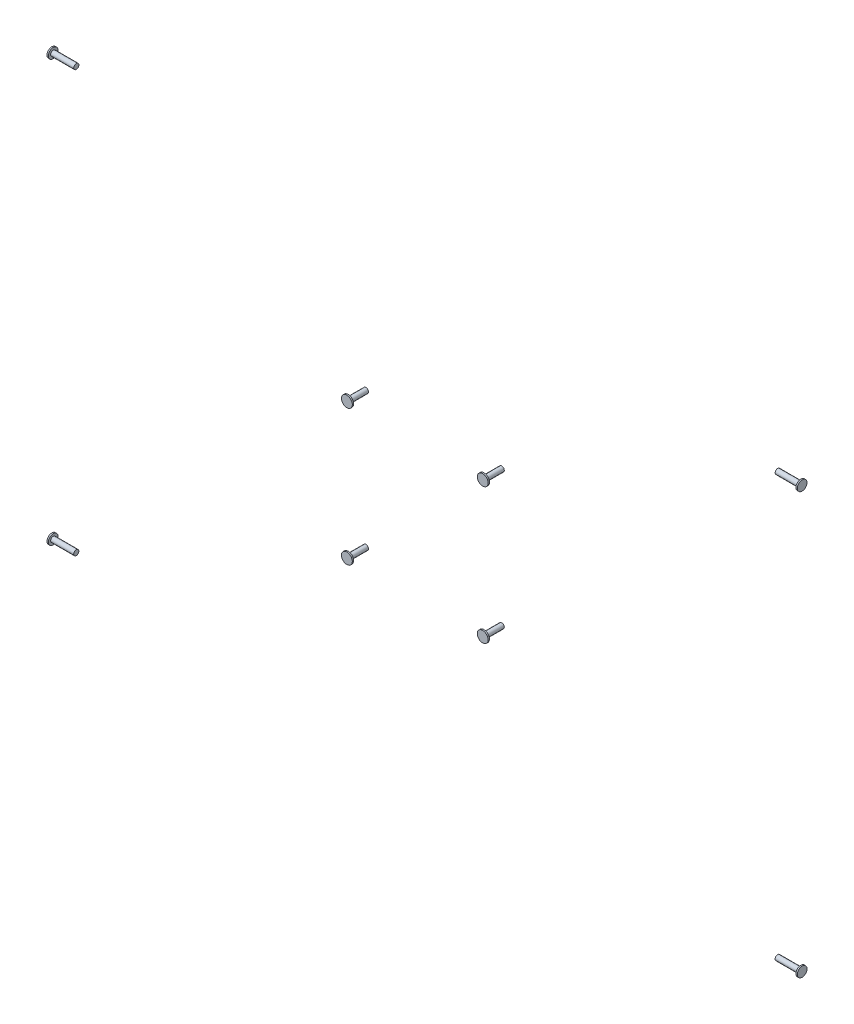
ISO-10303-21;
HEADER;
FILE_DESCRIPTION(('STEP AP214'),'2;1');
FILE_NAME('part.step','',(''),(''),'','','');
FILE_SCHEMA(('AUTOMOTIVE_DESIGN { 1 0 10303 214 1 1 1 1 }'));
ENDSEC;
DATA;
#1=APPLICATION_CONTEXT('core data for automotive mechanical design processes');
#2=APPLICATION_PROTOCOL_DEFINITION('international standard','automotive_design',2000,#1);
#3=PRODUCT_CONTEXT('',#1,'mechanical');
#4=PRODUCT('Part','Part','',(#3));
#5=PRODUCT_RELATED_PRODUCT_CATEGORY('part','',(#4));
#6=PRODUCT_DEFINITION_FORMATION('','',#4);
#7=PRODUCT_DEFINITION_CONTEXT('part definition',#1,'design');
#8=PRODUCT_DEFINITION('design','',#6,#7);
#9=PRODUCT_DEFINITION_SHAPE('','',#8);
#10=(LENGTH_UNIT() NAMED_UNIT(*) SI_UNIT(.MILLI.,.METRE.));
#11=(NAMED_UNIT(*) PLANE_ANGLE_UNIT() SI_UNIT($,.RADIAN.));
#12=(NAMED_UNIT(*) SI_UNIT($,.STERADIAN.) SOLID_ANGLE_UNIT());
#13=UNCERTAINTY_MEASURE_WITH_UNIT(LENGTH_MEASURE(1.E-05),#10,'distance_accuracy_value','');
#14=(GEOMETRIC_REPRESENTATION_CONTEXT(3) GLOBAL_UNCERTAINTY_ASSIGNED_CONTEXT((#13)) GLOBAL_UNIT_ASSIGNED_CONTEXT((#10,
#11,#12)) REPRESENTATION_CONTEXT('',''));
#15=CARTESIAN_POINT('',(0.,0.,0.));
#16=DIRECTION('',(0.,0.,1.));
#17=DIRECTION('',(1.,0.,0.));
#18=AXIS2_PLACEMENT_3D('',#15,#16,#17);
#19=CARTESIAN_POINT('',(-258.2,-155.,102.));
#20=DIRECTION('',(1.,0.,0.));
#21=DIRECTION('',(0.,0.,-1.));
#22=AXIS2_PLACEMENT_3D('',#19,#20,#21);
#23=PLANE('',#22);
#24=CARTESIAN_POINT('',(-258.2,-155.,102.));
#25=DIRECTION('',(-1.,0.,0.));
#26=DIRECTION('',(0.,0.,1.));
#27=AXIS2_PLACEMENT_3D('',#24,#25,#26);
#28=CIRCLE('',#27,1.9);
#29=CARTESIAN_POINT('',(-258.2,-155.,103.9));
#30=VERTEX_POINT('',#29);
#31=EDGE_CURVE('P0_E23',#30,#30,#28,.T.);
#32=ORIENTED_EDGE('',*,*,#31,.F.);
#33=EDGE_LOOP('',(#32));
#34=FACE_BOUND('',#33,.T.);
#35=ADVANCED_FACE('P0_F15',(#34),#23,.T.);
#36=CARTESIAN_POINT('',(-276.2,-155.,102.));
#37=DIRECTION('',(1.,0.,0.));
#38=DIRECTION('',(0.,0.,-1.));
#39=AXIS2_PLACEMENT_3D('',#36,#37,#38);
#40=CYLINDRICAL_SURFACE('',#39,1.9);
#41=CARTESIAN_POINT('',(-275.2,-155.,102.));
#42=DIRECTION('',(1.,0.,0.));
#43=DIRECTION('',(0.,0.,-1.));
#44=AXIS2_PLACEMENT_3D('',#41,#42,#43);
#45=CIRCLE('',#44,1.9);
#46=CARTESIAN_POINT('',(-275.2,-155.,100.1));
#47=VERTEX_POINT('',#46);
#48=EDGE_CURVE('P0_E10',#47,#47,#45,.F.);
#49=ORIENTED_EDGE('',*,*,#48,.F.);
#50=EDGE_LOOP('',(#49));
#51=FACE_BOUND('',#50,.T.);
#52=ORIENTED_EDGE('',*,*,#31,.T.);
#53=EDGE_LOOP('',(#52));
#54=FACE_BOUND('',#53,.T.);
#55=ADVANCED_FACE('P0_F17',(#51,#54),#40,.T.);
#56=CARTESIAN_POINT('',(-275.2,-155.,102.));
#57=DIRECTION('',(1.,0.,0.));
#58=DIRECTION('',(0.,0.,-1.));
#59=AXIS2_PLACEMENT_3D('',#56,#57,#58);
#60=PLANE('',#59);
#61=ORIENTED_EDGE('',*,*,#48,.T.);
#62=EDGE_LOOP('',(#61));
#63=FACE_BOUND('',#62,.T.);
#64=CARTESIAN_POINT('',(-275.2,-155.,102.));
#65=DIRECTION('',(-1.,0.,0.));
#66=DIRECTION('',(0.,0.,1.));
#67=AXIS2_PLACEMENT_3D('',#64,#65,#66);
#68=CIRCLE('',#67,3.6);
#69=CARTESIAN_POINT('',(-275.2,-155.,105.6));
#70=VERTEX_POINT('',#69);
#71=EDGE_CURVE('P0_E31',#70,#70,#68,.T.);
#72=ORIENTED_EDGE('',*,*,#71,.F.);
#73=EDGE_LOOP('',(#72));
#74=FACE_BOUND('',#73,.T.);
#75=ADVANCED_FACE('P0_F49',(#63,#74),#60,.T.);
#76=CARTESIAN_POINT('',(-276.2,-155.,102.));
#77=DIRECTION('',(1.,0.,0.));
#78=DIRECTION('',(0.,0.,-1.));
#79=AXIS2_PLACEMENT_3D('',#76,#77,#78);
#80=CYLINDRICAL_SURFACE('',#79,3.6);
#81=ORIENTED_EDGE('',*,*,#71,.T.);
#82=EDGE_LOOP('',(#81));
#83=FACE_BOUND('',#82,.T.);
#84=CARTESIAN_POINT('',(-276.2,-155.,102.));
#85=DIRECTION('',(1.,0.,0.));
#86=DIRECTION('',(0.,0.,-1.));
#87=AXIS2_PLACEMENT_3D('',#84,#85,#86);
#88=CIRCLE('',#87,3.6);
#89=CARTESIAN_POINT('',(-276.2,-155.,98.4));
#90=VERTEX_POINT('',#89);
#91=EDGE_CURVE('P0_E35',#90,#90,#88,.T.);
#92=ORIENTED_EDGE('',*,*,#91,.T.);
#93=EDGE_LOOP('',(#92));
#94=FACE_BOUND('',#93,.T.);
#95=ADVANCED_FACE('P0_F41',(#83,#94),#80,.T.);
#96=CARTESIAN_POINT('',(-276.2,-155.,102.));
#97=DIRECTION('',(-1.,0.,0.));
#98=DIRECTION('',(0.,0.,1.));
#99=AXIS2_PLACEMENT_3D('',#96,#97,#98);
#100=PLANE('',#99);
#101=ORIENTED_EDGE('',*,*,#91,.F.);
#102=EDGE_LOOP('',(#101));
#103=FACE_BOUND('',#102,.T.);
#104=ADVANCED_FACE('P0_F43',(#103),#100,.T.);
#105=CLOSED_SHELL('',(#35,#55,#75,#95,#104));
#106=MANIFOLD_SOLID_BREP('P0_B1',#105);
#107=CARTESIAN_POINT('',(-50.,-50.,97.));
#108=DIRECTION('',(0.,0.,-1.));
#109=DIRECTION('',(-1.,0.,0.));
#110=AXIS2_PLACEMENT_3D('',#107,#108,#109);
#111=PLANE('',#110);
#112=CARTESIAN_POINT('',(-50.,-50.,97.));
#113=DIRECTION('',(0.,0.,1.));
#114=DIRECTION('',(1.,0.,0.));
#115=AXIS2_PLACEMENT_3D('',#112,#113,#114);
#116=CIRCLE('',#115,1.9);
#117=CARTESIAN_POINT('',(-48.1,-50.,97.));
#118=VERTEX_POINT('',#117);
#119=EDGE_CURVE('P1_E10',#118,#118,#116,.T.);
#120=ORIENTED_EDGE('',*,*,#119,.F.);
#121=EDGE_LOOP('',(#120));
#122=FACE_BOUND('',#121,.T.);
#123=ADVANCED_FACE('P1_F15',(#122),#111,.T.);
#124=CARTESIAN_POINT('',(-50.,-50.,110.));
#125=DIRECTION('',(0.,0.,-1.));
#126=DIRECTION('',(-1.,0.,0.));
#127=AXIS2_PLACEMENT_3D('',#124,#125,#126);
#128=CYLINDRICAL_SURFACE('',#127,1.9);
#129=ORIENTED_EDGE('',*,*,#119,.T.);
#130=EDGE_LOOP('',(#129));
#131=FACE_BOUND('',#130,.T.);
#132=CARTESIAN_POINT('',(-50.,-50.,110.));
#133=DIRECTION('',(0.,0.,-1.));
#134=DIRECTION('',(-1.,0.,0.));
#135=AXIS2_PLACEMENT_3D('',#132,#133,#134);
#136=CIRCLE('',#135,1.9);
#137=CARTESIAN_POINT('',(-51.9,-50.,110.));
#138=VERTEX_POINT('',#137);
#139=EDGE_CURVE('P1_E23',#138,#138,#136,.F.);
#140=ORIENTED_EDGE('',*,*,#139,.F.);
#141=EDGE_LOOP('',(#140));
#142=FACE_BOUND('',#141,.T.);
#143=ADVANCED_FACE('P1_F17',(#131,#142),#128,.T.);
#144=CARTESIAN_POINT('',(-50.,-50.,111.));
#145=DIRECTION('',(0.,0.,1.));
#146=DIRECTION('',(1.,0.,0.));
#147=AXIS2_PLACEMENT_3D('',#144,#145,#146);
#148=PLANE('',#147);
#149=CARTESIAN_POINT('',(-50.,-50.,111.));
#150=DIRECTION('',(0.,0.,-1.));
#151=DIRECTION('',(-1.,0.,0.));
#152=AXIS2_PLACEMENT_3D('',#149,#150,#151);
#153=CIRCLE('',#152,4.);
#154=CARTESIAN_POINT('',(-54.,-50.,111.));
#155=VERTEX_POINT('',#154);
#156=EDGE_CURVE('P1_E30',#155,#155,#153,.T.);
#157=ORIENTED_EDGE('',*,*,#156,.F.);
#158=EDGE_LOOP('',(#157));
#159=FACE_BOUND('',#158,.T.);
#160=ADVANCED_FACE('P1_F45',(#159),#148,.T.);
#161=CARTESIAN_POINT('',(-50.,-50.,110.));
#162=DIRECTION('',(0.,0.,-1.));
#163=DIRECTION('',(-1.,0.,0.));
#164=AXIS2_PLACEMENT_3D('',#161,#162,#163);
#165=PLANE('',#164);
#166=ORIENTED_EDGE('',*,*,#139,.T.);
#167=EDGE_LOOP('',(#166));
#168=FACE_BOUND('',#167,.T.);
#169=CARTESIAN_POINT('',(-50.,-50.,110.));
#170=DIRECTION('',(0.,0.,1.));
#171=DIRECTION('',(1.,0.,0.));
#172=AXIS2_PLACEMENT_3D('',#169,#170,#171);
#173=CIRCLE('',#172,4.);
#174=CARTESIAN_POINT('',(-46.,-50.,110.));
#175=VERTEX_POINT('',#174);
#176=EDGE_CURVE('P1_E35',#175,#175,#173,.T.);
#177=ORIENTED_EDGE('',*,*,#176,.F.);
#178=EDGE_LOOP('',(#177));
#179=FACE_BOUND('',#178,.T.);
#180=ADVANCED_FACE('P1_F43',(#168,#179),#165,.T.);
#181=CARTESIAN_POINT('',(-50.,-50.,110.));
#182=DIRECTION('',(0.,0.,1.));
#183=DIRECTION('',(1.,0.,0.));
#184=AXIS2_PLACEMENT_3D('',#181,#182,#183);
#185=CYLINDRICAL_SURFACE('',#184,4.);
#186=ORIENTED_EDGE('',*,*,#156,.T.);
#187=EDGE_LOOP('',(#186));
#188=FACE_BOUND('',#187,.T.);
#189=ORIENTED_EDGE('',*,*,#176,.T.);
#190=EDGE_LOOP('',(#189));
#191=FACE_BOUND('',#190,.T.);
#192=ADVANCED_FACE('P1_F41',(#188,#191),#185,.T.);
#193=CLOSED_SHELL('',(#123,#143,#160,#180,#192));
#194=MANIFOLD_SOLID_BREP('P1_B1',#193);
#195=CARTESIAN_POINT('',(-50.,50.,97.));
#196=DIRECTION('',(0.,0.,-1.));
#197=DIRECTION('',(-1.,0.,0.));
#198=AXIS2_PLACEMENT_3D('',#195,#196,#197);
#199=PLANE('',#198);
#200=CARTESIAN_POINT('',(-50.,50.,97.));
#201=DIRECTION('',(0.,0.,1.));
#202=DIRECTION('',(1.,0.,0.));
#203=AXIS2_PLACEMENT_3D('',#200,#201,#202);
#204=CIRCLE('',#203,1.9);
#205=CARTESIAN_POINT('',(-48.1,50.,97.));
#206=VERTEX_POINT('',#205);
#207=EDGE_CURVE('P2_E10',#206,#206,#204,.T.);
#208=ORIENTED_EDGE('',*,*,#207,.F.);
#209=EDGE_LOOP('',(#208));
#210=FACE_BOUND('',#209,.T.);
#211=ADVANCED_FACE('P2_F15',(#210),#199,.T.);
#212=CARTESIAN_POINT('',(-50.,50.,110.));
#213=DIRECTION('',(0.,0.,-1.));
#214=DIRECTION('',(-1.,0.,0.));
#215=AXIS2_PLACEMENT_3D('',#212,#213,#214);
#216=CYLINDRICAL_SURFACE('',#215,1.9);
#217=ORIENTED_EDGE('',*,*,#207,.T.);
#218=EDGE_LOOP('',(#217));
#219=FACE_BOUND('',#218,.T.);
#220=CARTESIAN_POINT('',(-50.,50.,110.));
#221=DIRECTION('',(0.,0.,-1.));
#222=DIRECTION('',(-1.,0.,0.));
#223=AXIS2_PLACEMENT_3D('',#220,#221,#222);
#224=CIRCLE('',#223,1.9);
#225=CARTESIAN_POINT('',(-51.9,50.,110.));
#226=VERTEX_POINT('',#225);
#227=EDGE_CURVE('P2_E23',#226,#226,#224,.F.);
#228=ORIENTED_EDGE('',*,*,#227,.F.);
#229=EDGE_LOOP('',(#228));
#230=FACE_BOUND('',#229,.T.);
#231=ADVANCED_FACE('P2_F17',(#219,#230),#216,.T.);
#232=CARTESIAN_POINT('',(-50.,50.,111.));
#233=DIRECTION('',(0.,0.,1.));
#234=DIRECTION('',(1.,0.,0.));
#235=AXIS2_PLACEMENT_3D('',#232,#233,#234);
#236=PLANE('',#235);
#237=CARTESIAN_POINT('',(-50.,50.,111.));
#238=DIRECTION('',(0.,0.,-1.));
#239=DIRECTION('',(-1.,0.,0.));
#240=AXIS2_PLACEMENT_3D('',#237,#238,#239);
#241=CIRCLE('',#240,4.);
#242=CARTESIAN_POINT('',(-54.,50.,111.));
#243=VERTEX_POINT('',#242);
#244=EDGE_CURVE('P2_E30',#243,#243,#241,.T.);
#245=ORIENTED_EDGE('',*,*,#244,.F.);
#246=EDGE_LOOP('',(#245));
#247=FACE_BOUND('',#246,.T.);
#248=ADVANCED_FACE('P2_F45',(#247),#236,.T.);
#249=CARTESIAN_POINT('',(-50.,50.,110.));
#250=DIRECTION('',(0.,0.,-1.));
#251=DIRECTION('',(-1.,0.,0.));
#252=AXIS2_PLACEMENT_3D('',#249,#250,#251);
#253=PLANE('',#252);
#254=ORIENTED_EDGE('',*,*,#227,.T.);
#255=EDGE_LOOP('',(#254));
#256=FACE_BOUND('',#255,.T.);
#257=CARTESIAN_POINT('',(-50.,50.,110.));
#258=DIRECTION('',(0.,0.,1.));
#259=DIRECTION('',(1.,0.,0.));
#260=AXIS2_PLACEMENT_3D('',#257,#258,#259);
#261=CIRCLE('',#260,4.);
#262=CARTESIAN_POINT('',(-46.,50.,110.));
#263=VERTEX_POINT('',#262);
#264=EDGE_CURVE('P2_E35',#263,#263,#261,.T.);
#265=ORIENTED_EDGE('',*,*,#264,.F.);
#266=EDGE_LOOP('',(#265));
#267=FACE_BOUND('',#266,.T.);
#268=ADVANCED_FACE('P2_F43',(#256,#267),#253,.T.);
#269=CARTESIAN_POINT('',(-50.,50.,110.));
#270=DIRECTION('',(0.,0.,1.));
#271=DIRECTION('',(1.,0.,0.));
#272=AXIS2_PLACEMENT_3D('',#269,#270,#271);
#273=CYLINDRICAL_SURFACE('',#272,4.);
#274=ORIENTED_EDGE('',*,*,#244,.T.);
#275=EDGE_LOOP('',(#274));
#276=FACE_BOUND('',#275,.T.);
#277=ORIENTED_EDGE('',*,*,#264,.T.);
#278=EDGE_LOOP('',(#277));
#279=FACE_BOUND('',#278,.T.);
#280=ADVANCED_FACE('P2_F41',(#276,#279),#273,.T.);
#281=CLOSED_SHELL('',(#211,#231,#248,#268,#280));
#282=MANIFOLD_SOLID_BREP('P2_B1',#281);
#283=CARTESIAN_POINT('',(-258.2,155.,102.));
#284=DIRECTION('',(1.,0.,0.));
#285=DIRECTION('',(0.,0.,-1.));
#286=AXIS2_PLACEMENT_3D('',#283,#284,#285);
#287=PLANE('',#286);
#288=CARTESIAN_POINT('',(-258.2,155.,102.));
#289=DIRECTION('',(-1.,0.,0.));
#290=DIRECTION('',(0.,0.,1.));
#291=AXIS2_PLACEMENT_3D('',#288,#289,#290);
#292=CIRCLE('',#291,1.9);
#293=CARTESIAN_POINT('',(-258.2,155.,103.9));
#294=VERTEX_POINT('',#293);
#295=EDGE_CURVE('P3_E23',#294,#294,#292,.T.);
#296=ORIENTED_EDGE('',*,*,#295,.F.);
#297=EDGE_LOOP('',(#296));
#298=FACE_BOUND('',#297,.T.);
#299=ADVANCED_FACE('P3_F15',(#298),#287,.T.);
#300=CARTESIAN_POINT('',(-276.2,155.,102.));
#301=DIRECTION('',(1.,0.,0.));
#302=DIRECTION('',(0.,0.,-1.));
#303=AXIS2_PLACEMENT_3D('',#300,#301,#302);
#304=CYLINDRICAL_SURFACE('',#303,1.9);
#305=CARTESIAN_POINT('',(-275.2,155.,102.));
#306=DIRECTION('',(1.,0.,0.));
#307=DIRECTION('',(0.,0.,-1.));
#308=AXIS2_PLACEMENT_3D('',#305,#306,#307);
#309=CIRCLE('',#308,1.9);
#310=CARTESIAN_POINT('',(-275.2,155.,100.1));
#311=VERTEX_POINT('',#310);
#312=EDGE_CURVE('P3_E10',#311,#311,#309,.F.);
#313=ORIENTED_EDGE('',*,*,#312,.F.);
#314=EDGE_LOOP('',(#313));
#315=FACE_BOUND('',#314,.T.);
#316=ORIENTED_EDGE('',*,*,#295,.T.);
#317=EDGE_LOOP('',(#316));
#318=FACE_BOUND('',#317,.T.);
#319=ADVANCED_FACE('P3_F17',(#315,#318),#304,.T.);
#320=CARTESIAN_POINT('',(-275.2,155.,102.));
#321=DIRECTION('',(1.,0.,0.));
#322=DIRECTION('',(0.,0.,-1.));
#323=AXIS2_PLACEMENT_3D('',#320,#321,#322);
#324=PLANE('',#323);
#325=ORIENTED_EDGE('',*,*,#312,.T.);
#326=EDGE_LOOP('',(#325));
#327=FACE_BOUND('',#326,.T.);
#328=CARTESIAN_POINT('',(-275.2,155.,102.));
#329=DIRECTION('',(-1.,0.,0.));
#330=DIRECTION('',(0.,0.,1.));
#331=AXIS2_PLACEMENT_3D('',#328,#329,#330);
#332=CIRCLE('',#331,3.6);
#333=CARTESIAN_POINT('',(-275.2,155.,105.6));
#334=VERTEX_POINT('',#333);
#335=EDGE_CURVE('P3_E30',#334,#334,#332,.T.);
#336=ORIENTED_EDGE('',*,*,#335,.F.);
#337=EDGE_LOOP('',(#336));
#338=FACE_BOUND('',#337,.T.);
#339=ADVANCED_FACE('P3_F49',(#327,#338),#324,.T.);
#340=CARTESIAN_POINT('',(-276.2,155.,102.));
#341=DIRECTION('',(1.,0.,0.));
#342=DIRECTION('',(0.,0.,-1.));
#343=AXIS2_PLACEMENT_3D('',#340,#341,#342);
#344=CYLINDRICAL_SURFACE('',#343,3.6);
#345=ORIENTED_EDGE('',*,*,#335,.T.);
#346=EDGE_LOOP('',(#345));
#347=FACE_BOUND('',#346,.T.);
#348=CARTESIAN_POINT('',(-276.2,155.,102.));
#349=DIRECTION('',(1.,0.,0.));
#350=DIRECTION('',(0.,0.,-1.));
#351=AXIS2_PLACEMENT_3D('',#348,#349,#350);
#352=CIRCLE('',#351,3.6);
#353=CARTESIAN_POINT('',(-276.2,155.,98.4));
#354=VERTEX_POINT('',#353);
#355=EDGE_CURVE('P3_E34',#354,#354,#352,.T.);
#356=ORIENTED_EDGE('',*,*,#355,.T.);
#357=EDGE_LOOP('',(#356));
#358=FACE_BOUND('',#357,.T.);
#359=ADVANCED_FACE('P3_F41',(#347,#358),#344,.T.);
#360=CARTESIAN_POINT('',(-276.2,155.,102.));
#361=DIRECTION('',(-1.,0.,0.));
#362=DIRECTION('',(0.,0.,1.));
#363=AXIS2_PLACEMENT_3D('',#360,#361,#362);
#364=PLANE('',#363);
#365=ORIENTED_EDGE('',*,*,#355,.F.);
#366=EDGE_LOOP('',(#365));
#367=FACE_BOUND('',#366,.T.);
#368=ADVANCED_FACE('P3_F43',(#367),#364,.T.);
#369=CLOSED_SHELL('',(#299,#319,#339,#359,#368));
#370=MANIFOLD_SOLID_BREP('P3_B1',#369);
#371=CARTESIAN_POINT('',(50.,-50.,97.));
#372=DIRECTION('',(0.,0.,-1.));
#373=DIRECTION('',(-1.,0.,0.));
#374=AXIS2_PLACEMENT_3D('',#371,#372,#373);
#375=PLANE('',#374);
#376=CARTESIAN_POINT('',(50.,-50.,97.));
#377=DIRECTION('',(0.,0.,1.));
#378=DIRECTION('',(1.,0.,0.));
#379=AXIS2_PLACEMENT_3D('',#376,#377,#378);
#380=CIRCLE('',#379,1.9);
#381=CARTESIAN_POINT('',(51.9,-50.,97.));
#382=VERTEX_POINT('',#381);
#383=EDGE_CURVE('P4_E10',#382,#382,#380,.T.);
#384=ORIENTED_EDGE('',*,*,#383,.F.);
#385=EDGE_LOOP('',(#384));
#386=FACE_BOUND('',#385,.T.);
#387=ADVANCED_FACE('P4_F15',(#386),#375,.T.);
#388=CARTESIAN_POINT('',(50.,-50.,110.));
#389=DIRECTION('',(0.,0.,-1.));
#390=DIRECTION('',(-1.,0.,0.));
#391=AXIS2_PLACEMENT_3D('',#388,#389,#390);
#392=CYLINDRICAL_SURFACE('',#391,1.9);
#393=ORIENTED_EDGE('',*,*,#383,.T.);
#394=EDGE_LOOP('',(#393));
#395=FACE_BOUND('',#394,.T.);
#396=CARTESIAN_POINT('',(50.,-50.,110.));
#397=DIRECTION('',(0.,0.,-1.));
#398=DIRECTION('',(-1.,0.,0.));
#399=AXIS2_PLACEMENT_3D('',#396,#397,#398);
#400=CIRCLE('',#399,1.9);
#401=CARTESIAN_POINT('',(48.1,-50.,110.));
#402=VERTEX_POINT('',#401);
#403=EDGE_CURVE('P4_E23',#402,#402,#400,.F.);
#404=ORIENTED_EDGE('',*,*,#403,.F.);
#405=EDGE_LOOP('',(#404));
#406=FACE_BOUND('',#405,.T.);
#407=ADVANCED_FACE('P4_F17',(#395,#406),#392,.T.);
#408=CARTESIAN_POINT('',(50.,-50.,111.));
#409=DIRECTION('',(0.,0.,1.));
#410=DIRECTION('',(1.,0.,0.));
#411=AXIS2_PLACEMENT_3D('',#408,#409,#410);
#412=PLANE('',#411);
#413=CARTESIAN_POINT('',(50.,-50.,111.));
#414=DIRECTION('',(0.,0.,-1.));
#415=DIRECTION('',(-1.,0.,0.));
#416=AXIS2_PLACEMENT_3D('',#413,#414,#415);
#417=CIRCLE('',#416,4.);
#418=CARTESIAN_POINT('',(46.,-50.,111.));
#419=VERTEX_POINT('',#418);
#420=EDGE_CURVE('P4_E30',#419,#419,#417,.T.);
#421=ORIENTED_EDGE('',*,*,#420,.F.);
#422=EDGE_LOOP('',(#421));
#423=FACE_BOUND('',#422,.T.);
#424=ADVANCED_FACE('P4_F45',(#423),#412,.T.);
#425=CARTESIAN_POINT('',(50.,-50.,110.));
#426=DIRECTION('',(0.,0.,-1.));
#427=DIRECTION('',(-1.,0.,0.));
#428=AXIS2_PLACEMENT_3D('',#425,#426,#427);
#429=PLANE('',#428);
#430=ORIENTED_EDGE('',*,*,#403,.T.);
#431=EDGE_LOOP('',(#430));
#432=FACE_BOUND('',#431,.T.);
#433=CARTESIAN_POINT('',(50.,-50.,110.));
#434=DIRECTION('',(0.,0.,1.));
#435=DIRECTION('',(1.,0.,0.));
#436=AXIS2_PLACEMENT_3D('',#433,#434,#435);
#437=CIRCLE('',#436,4.);
#438=CARTESIAN_POINT('',(54.,-50.,110.));
#439=VERTEX_POINT('',#438);
#440=EDGE_CURVE('P4_E35',#439,#439,#437,.T.);
#441=ORIENTED_EDGE('',*,*,#440,.F.);
#442=EDGE_LOOP('',(#441));
#443=FACE_BOUND('',#442,.T.);
#444=ADVANCED_FACE('P4_F43',(#432,#443),#429,.T.);
#445=CARTESIAN_POINT('',(50.,-50.,110.));
#446=DIRECTION('',(0.,0.,1.));
#447=DIRECTION('',(1.,0.,0.));
#448=AXIS2_PLACEMENT_3D('',#445,#446,#447);
#449=CYLINDRICAL_SURFACE('',#448,4.);
#450=ORIENTED_EDGE('',*,*,#420,.T.);
#451=EDGE_LOOP('',(#450));
#452=FACE_BOUND('',#451,.T.);
#453=ORIENTED_EDGE('',*,*,#440,.T.);
#454=EDGE_LOOP('',(#453));
#455=FACE_BOUND('',#454,.T.);
#456=ADVANCED_FACE('P4_F41',(#452,#455),#449,.T.);
#457=CLOSED_SHELL('',(#387,#407,#424,#444,#456));
#458=MANIFOLD_SOLID_BREP('P4_B1',#457);
#459=CARTESIAN_POINT('',(258.2,-155.,102.));
#460=DIRECTION('',(-1.,0.,0.));
#461=DIRECTION('',(0.,0.,1.));
#462=AXIS2_PLACEMENT_3D('',#459,#460,#461);
#463=PLANE('',#462);
#464=CARTESIAN_POINT('',(258.2,-155.,102.));
#465=DIRECTION('',(1.,0.,0.));
#466=DIRECTION('',(0.,0.,-1.));
#467=AXIS2_PLACEMENT_3D('',#464,#465,#466);
#468=CIRCLE('',#467,1.9);
#469=CARTESIAN_POINT('',(258.2,-155.,100.1));
#470=VERTEX_POINT('',#469);
#471=EDGE_CURVE('P5_E23',#470,#470,#468,.T.);
#472=ORIENTED_EDGE('',*,*,#471,.F.);
#473=EDGE_LOOP('',(#472));
#474=FACE_BOUND('',#473,.T.);
#475=ADVANCED_FACE('P5_F15',(#474),#463,.T.);
#476=CARTESIAN_POINT('',(276.2,-155.,102.));
#477=DIRECTION('',(-1.,0.,0.));
#478=DIRECTION('',(0.,0.,1.));
#479=AXIS2_PLACEMENT_3D('',#476,#477,#478);
#480=CYLINDRICAL_SURFACE('',#479,1.9);
#481=CARTESIAN_POINT('',(275.2,-155.,102.));
#482=DIRECTION('',(-1.,0.,0.));
#483=DIRECTION('',(0.,0.,1.));
#484=AXIS2_PLACEMENT_3D('',#481,#482,#483);
#485=CIRCLE('',#484,1.9);
#486=CARTESIAN_POINT('',(275.2,-155.,103.9));
#487=VERTEX_POINT('',#486);
#488=EDGE_CURVE('P5_E10',#487,#487,#485,.F.);
#489=ORIENTED_EDGE('',*,*,#488,.F.);
#490=EDGE_LOOP('',(#489));
#491=FACE_BOUND('',#490,.T.);
#492=ORIENTED_EDGE('',*,*,#471,.T.);
#493=EDGE_LOOP('',(#492));
#494=FACE_BOUND('',#493,.T.);
#495=ADVANCED_FACE('P5_F17',(#491,#494),#480,.T.);
#496=CARTESIAN_POINT('',(275.2,-155.,102.));
#497=DIRECTION('',(-1.,0.,0.));
#498=DIRECTION('',(0.,0.,1.));
#499=AXIS2_PLACEMENT_3D('',#496,#497,#498);
#500=PLANE('',#499);
#501=ORIENTED_EDGE('',*,*,#488,.T.);
#502=EDGE_LOOP('',(#501));
#503=FACE_BOUND('',#502,.T.);
#504=CARTESIAN_POINT('',(275.2,-155.,102.));
#505=DIRECTION('',(1.,0.,0.));
#506=DIRECTION('',(0.,0.,-1.));
#507=AXIS2_PLACEMENT_3D('',#504,#505,#506);
#508=CIRCLE('',#507,3.6);
#509=CARTESIAN_POINT('',(275.2,-155.,98.4));
#510=VERTEX_POINT('',#509);
#511=EDGE_CURVE('P5_E30',#510,#510,#508,.T.);
#512=ORIENTED_EDGE('',*,*,#511,.F.);
#513=EDGE_LOOP('',(#512));
#514=FACE_BOUND('',#513,.T.);
#515=ADVANCED_FACE('P5_F49',(#503,#514),#500,.T.);
#516=CARTESIAN_POINT('',(276.2,-155.,102.));
#517=DIRECTION('',(-1.,0.,0.));
#518=DIRECTION('',(0.,0.,1.));
#519=AXIS2_PLACEMENT_3D('',#516,#517,#518);
#520=CYLINDRICAL_SURFACE('',#519,3.6);
#521=ORIENTED_EDGE('',*,*,#511,.T.);
#522=EDGE_LOOP('',(#521));
#523=FACE_BOUND('',#522,.T.);
#524=CARTESIAN_POINT('',(276.2,-155.,102.));
#525=DIRECTION('',(-1.,0.,0.));
#526=DIRECTION('',(0.,0.,1.));
#527=AXIS2_PLACEMENT_3D('',#524,#525,#526);
#528=CIRCLE('',#527,3.6);
#529=CARTESIAN_POINT('',(276.2,-155.,105.6));
#530=VERTEX_POINT('',#529);
#531=EDGE_CURVE('P5_E35',#530,#530,#528,.T.);
#532=ORIENTED_EDGE('',*,*,#531,.T.);
#533=EDGE_LOOP('',(#532));
#534=FACE_BOUND('',#533,.T.);
#535=ADVANCED_FACE('P5_F41',(#523,#534),#520,.T.);
#536=CARTESIAN_POINT('',(276.2,-155.,102.));
#537=DIRECTION('',(1.,0.,0.));
#538=DIRECTION('',(0.,0.,-1.));
#539=AXIS2_PLACEMENT_3D('',#536,#537,#538);
#540=PLANE('',#539);
#541=ORIENTED_EDGE('',*,*,#531,.F.);
#542=EDGE_LOOP('',(#541));
#543=FACE_BOUND('',#542,.T.);
#544=ADVANCED_FACE('P5_F43',(#543),#540,.T.);
#545=CLOSED_SHELL('',(#475,#495,#515,#535,#544));
#546=MANIFOLD_SOLID_BREP('P5_B1',#545);
#547=CARTESIAN_POINT('',(50.,50.,97.));
#548=DIRECTION('',(0.,0.,-1.));
#549=DIRECTION('',(-1.,0.,0.));
#550=AXIS2_PLACEMENT_3D('',#547,#548,#549);
#551=PLANE('',#550);
#552=CARTESIAN_POINT('',(50.,50.,97.));
#553=DIRECTION('',(0.,0.,1.));
#554=DIRECTION('',(1.,0.,0.));
#555=AXIS2_PLACEMENT_3D('',#552,#553,#554);
#556=CIRCLE('',#555,1.9);
#557=CARTESIAN_POINT('',(51.9,50.,97.));
#558=VERTEX_POINT('',#557);
#559=EDGE_CURVE('P6_E10',#558,#558,#556,.T.);
#560=ORIENTED_EDGE('',*,*,#559,.F.);
#561=EDGE_LOOP('',(#560));
#562=FACE_BOUND('',#561,.T.);
#563=ADVANCED_FACE('P6_F15',(#562),#551,.T.);
#564=CARTESIAN_POINT('',(50.,50.,110.));
#565=DIRECTION('',(0.,0.,-1.));
#566=DIRECTION('',(-1.,0.,0.));
#567=AXIS2_PLACEMENT_3D('',#564,#565,#566);
#568=CYLINDRICAL_SURFACE('',#567,1.9);
#569=ORIENTED_EDGE('',*,*,#559,.T.);
#570=EDGE_LOOP('',(#569));
#571=FACE_BOUND('',#570,.T.);
#572=CARTESIAN_POINT('',(50.,50.,110.));
#573=DIRECTION('',(0.,0.,-1.));
#574=DIRECTION('',(-1.,0.,0.));
#575=AXIS2_PLACEMENT_3D('',#572,#573,#574);
#576=CIRCLE('',#575,1.9);
#577=CARTESIAN_POINT('',(48.1,50.,110.));
#578=VERTEX_POINT('',#577);
#579=EDGE_CURVE('P6_E23',#578,#578,#576,.F.);
#580=ORIENTED_EDGE('',*,*,#579,.F.);
#581=EDGE_LOOP('',(#580));
#582=FACE_BOUND('',#581,.T.);
#583=ADVANCED_FACE('P6_F17',(#571,#582),#568,.T.);
#584=CARTESIAN_POINT('',(50.,50.,111.));
#585=DIRECTION('',(0.,0.,1.));
#586=DIRECTION('',(1.,0.,0.));
#587=AXIS2_PLACEMENT_3D('',#584,#585,#586);
#588=PLANE('',#587);
#589=CARTESIAN_POINT('',(50.,50.,111.));
#590=DIRECTION('',(0.,0.,-1.));
#591=DIRECTION('',(-1.,0.,0.));
#592=AXIS2_PLACEMENT_3D('',#589,#590,#591);
#593=CIRCLE('',#592,4.);
#594=CARTESIAN_POINT('',(46.,50.,111.));
#595=VERTEX_POINT('',#594);
#596=EDGE_CURVE('P6_E30',#595,#595,#593,.T.);
#597=ORIENTED_EDGE('',*,*,#596,.F.);
#598=EDGE_LOOP('',(#597));
#599=FACE_BOUND('',#598,.T.);
#600=ADVANCED_FACE('P6_F45',(#599),#588,.T.);
#601=CARTESIAN_POINT('',(50.,50.,110.));
#602=DIRECTION('',(0.,0.,-1.));
#603=DIRECTION('',(-1.,0.,0.));
#604=AXIS2_PLACEMENT_3D('',#601,#602,#603);
#605=PLANE('',#604);
#606=ORIENTED_EDGE('',*,*,#579,.T.);
#607=EDGE_LOOP('',(#606));
#608=FACE_BOUND('',#607,.T.);
#609=CARTESIAN_POINT('',(50.,50.,110.));
#610=DIRECTION('',(0.,0.,1.));
#611=DIRECTION('',(1.,0.,0.));
#612=AXIS2_PLACEMENT_3D('',#609,#610,#611);
#613=CIRCLE('',#612,4.);
#614=CARTESIAN_POINT('',(54.,50.,110.));
#615=VERTEX_POINT('',#614);
#616=EDGE_CURVE('P6_E35',#615,#615,#613,.T.);
#617=ORIENTED_EDGE('',*,*,#616,.F.);
#618=EDGE_LOOP('',(#617));
#619=FACE_BOUND('',#618,.T.);
#620=ADVANCED_FACE('P6_F43',(#608,#619),#605,.T.);
#621=CARTESIAN_POINT('',(50.,50.,110.));
#622=DIRECTION('',(0.,0.,1.));
#623=DIRECTION('',(1.,0.,0.));
#624=AXIS2_PLACEMENT_3D('',#621,#622,#623);
#625=CYLINDRICAL_SURFACE('',#624,4.);
#626=ORIENTED_EDGE('',*,*,#596,.T.);
#627=EDGE_LOOP('',(#626));
#628=FACE_BOUND('',#627,.T.);
#629=ORIENTED_EDGE('',*,*,#616,.T.);
#630=EDGE_LOOP('',(#629));
#631=FACE_BOUND('',#630,.T.);
#632=ADVANCED_FACE('P6_F41',(#628,#631),#625,.T.);
#633=CLOSED_SHELL('',(#563,#583,#600,#620,#632));
#634=MANIFOLD_SOLID_BREP('P6_B1',#633);
#635=CARTESIAN_POINT('',(258.2,155.,102.));
#636=DIRECTION('',(-1.,0.,0.));
#637=DIRECTION('',(0.,0.,1.));
#638=AXIS2_PLACEMENT_3D('',#635,#636,#637);
#639=PLANE('',#638);
#640=CARTESIAN_POINT('',(258.2,155.,102.));
#641=DIRECTION('',(1.,0.,0.));
#642=DIRECTION('',(0.,0.,-1.));
#643=AXIS2_PLACEMENT_3D('',#640,#641,#642);
#644=CIRCLE('',#643,1.9);
#645=CARTESIAN_POINT('',(258.2,155.,100.1));
#646=VERTEX_POINT('',#645);
#647=EDGE_CURVE('P7_E23',#646,#646,#644,.T.);
#648=ORIENTED_EDGE('',*,*,#647,.F.);
#649=EDGE_LOOP('',(#648));
#650=FACE_BOUND('',#649,.T.);
#651=ADVANCED_FACE('P7_F15',(#650),#639,.T.);
#652=CARTESIAN_POINT('',(276.2,155.,102.));
#653=DIRECTION('',(-1.,0.,0.));
#654=DIRECTION('',(0.,0.,1.));
#655=AXIS2_PLACEMENT_3D('',#652,#653,#654);
#656=CYLINDRICAL_SURFACE('',#655,1.9);
#657=CARTESIAN_POINT('',(275.2,155.,102.));
#658=DIRECTION('',(-1.,0.,0.));
#659=DIRECTION('',(0.,0.,1.));
#660=AXIS2_PLACEMENT_3D('',#657,#658,#659);
#661=CIRCLE('',#660,1.9);
#662=CARTESIAN_POINT('',(275.2,155.,103.9));
#663=VERTEX_POINT('',#662);
#664=EDGE_CURVE('P7_E10',#663,#663,#661,.F.);
#665=ORIENTED_EDGE('',*,*,#664,.F.);
#666=EDGE_LOOP('',(#665));
#667=FACE_BOUND('',#666,.T.);
#668=ORIENTED_EDGE('',*,*,#647,.T.);
#669=EDGE_LOOP('',(#668));
#670=FACE_BOUND('',#669,.T.);
#671=ADVANCED_FACE('P7_F17',(#667,#670),#656,.T.);
#672=CARTESIAN_POINT('',(275.2,155.,102.));
#673=DIRECTION('',(-1.,0.,0.));
#674=DIRECTION('',(0.,0.,1.));
#675=AXIS2_PLACEMENT_3D('',#672,#673,#674);
#676=PLANE('',#675);
#677=ORIENTED_EDGE('',*,*,#664,.T.);
#678=EDGE_LOOP('',(#677));
#679=FACE_BOUND('',#678,.T.);
#680=CARTESIAN_POINT('',(275.2,155.,102.));
#681=DIRECTION('',(1.,0.,0.));
#682=DIRECTION('',(0.,0.,-1.));
#683=AXIS2_PLACEMENT_3D('',#680,#681,#682);
#684=CIRCLE('',#683,3.6);
#685=CARTESIAN_POINT('',(275.2,155.,98.4));
#686=VERTEX_POINT('',#685);
#687=EDGE_CURVE('P7_E30',#686,#686,#684,.T.);
#688=ORIENTED_EDGE('',*,*,#687,.F.);
#689=EDGE_LOOP('',(#688));
#690=FACE_BOUND('',#689,.T.);
#691=ADVANCED_FACE('P7_F49',(#679,#690),#676,.T.);
#692=CARTESIAN_POINT('',(276.2,155.,102.));
#693=DIRECTION('',(-1.,0.,0.));
#694=DIRECTION('',(0.,0.,1.));
#695=AXIS2_PLACEMENT_3D('',#692,#693,#694);
#696=CYLINDRICAL_SURFACE('',#695,3.6);
#697=ORIENTED_EDGE('',*,*,#687,.T.);
#698=EDGE_LOOP('',(#697));
#699=FACE_BOUND('',#698,.T.);
#700=CARTESIAN_POINT('',(276.2,155.,102.));
#701=DIRECTION('',(-1.,0.,0.));
#702=DIRECTION('',(0.,0.,1.));
#703=AXIS2_PLACEMENT_3D('',#700,#701,#702);
#704=CIRCLE('',#703,3.6);
#705=CARTESIAN_POINT('',(276.2,155.,105.6));
#706=VERTEX_POINT('',#705);
#707=EDGE_CURVE('P7_E35',#706,#706,#704,.T.);
#708=ORIENTED_EDGE('',*,*,#707,.T.);
#709=EDGE_LOOP('',(#708));
#710=FACE_BOUND('',#709,.T.);
#711=ADVANCED_FACE('P7_F41',(#699,#710),#696,.T.);
#712=CARTESIAN_POINT('',(276.2,155.,102.));
#713=DIRECTION('',(1.,0.,0.));
#714=DIRECTION('',(0.,0.,-1.));
#715=AXIS2_PLACEMENT_3D('',#712,#713,#714);
#716=PLANE('',#715);
#717=ORIENTED_EDGE('',*,*,#707,.F.);
#718=EDGE_LOOP('',(#717));
#719=FACE_BOUND('',#718,.T.);
#720=ADVANCED_FACE('P7_F43',(#719),#716,.T.);
#721=CLOSED_SHELL('',(#651,#671,#691,#711,#720));
#722=MANIFOLD_SOLID_BREP('P7_B1',#721);
#723=ADVANCED_BREP_SHAPE_REPRESENTATION('',(#18,#106,#194,#282,#370,#458,#546,#634,#722),#14);
#724=SHAPE_DEFINITION_REPRESENTATION(#9,#723);
ENDSEC;
END-ISO-10303-21;
